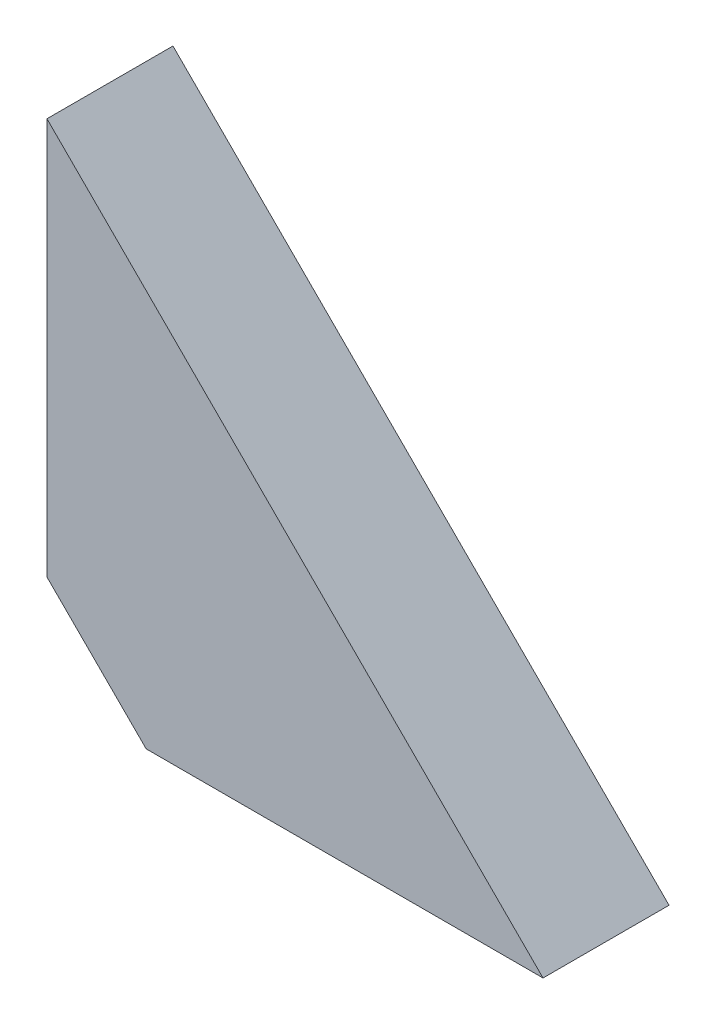
ISO-10303-21;
HEADER;
FILE_DESCRIPTION(('STEP AP214'),'2;1');
FILE_NAME('part.step','',(''),(''),'','','');
FILE_SCHEMA(('AUTOMOTIVE_DESIGN { 1 0 10303 214 1 1 1 1 }'));
ENDSEC;
DATA;
#1=APPLICATION_CONTEXT('core data for automotive mechanical design processes');
#2=APPLICATION_PROTOCOL_DEFINITION('international standard','automotive_design',2000,#1);
#3=PRODUCT_CONTEXT('',#1,'mechanical');
#4=PRODUCT('Part','Part','',(#3));
#5=PRODUCT_RELATED_PRODUCT_CATEGORY('part','',(#4));
#6=PRODUCT_DEFINITION_FORMATION('','',#4);
#7=PRODUCT_DEFINITION_CONTEXT('part definition',#1,'design');
#8=PRODUCT_DEFINITION('design','',#6,#7);
#9=PRODUCT_DEFINITION_SHAPE('','',#8);
#10=(LENGTH_UNIT() NAMED_UNIT(*) SI_UNIT(.MILLI.,.METRE.));
#11=(NAMED_UNIT(*) PLANE_ANGLE_UNIT() SI_UNIT($,.RADIAN.));
#12=(NAMED_UNIT(*) SI_UNIT($,.STERADIAN.) SOLID_ANGLE_UNIT());
#13=UNCERTAINTY_MEASURE_WITH_UNIT(LENGTH_MEASURE(1.E-05),#10,'distance_accuracy_value','');
#14=(GEOMETRIC_REPRESENTATION_CONTEXT(3) GLOBAL_UNCERTAINTY_ASSIGNED_CONTEXT((#13)) GLOBAL_UNIT_ASSIGNED_CONTEXT((#10,
#11,#12)) REPRESENTATION_CONTEXT('',''));
#15=CARTESIAN_POINT('',(0.,0.,0.));
#16=DIRECTION('',(0.,0.,1.));
#17=DIRECTION('',(1.,0.,0.));
#18=AXIS2_PLACEMENT_3D('',#15,#16,#17);
#19=CARTESIAN_POINT('',(0.,0.,-12.7));
#20=DIRECTION('',(-1.,0.,0.));
#21=DIRECTION('',(0.,0.,1.));
#22=AXIS2_PLACEMENT_3D('',#19,#20,#21);
#23=PLANE('',#22);
#24=DIRECTION('',(0.,-1.,0.));
#25=VECTOR('',#24,1.);
#26=CARTESIAN_POINT('',(0.,0.,-12.7));
#27=LINE('',#26,#25);
#28=CARTESIAN_POINT('',(0.,50.,-12.7));
#29=VERTEX_POINT('',#28);
#30=CARTESIAN_POINT('',(0.,10.,-12.7));
#31=VERTEX_POINT('',#30);
#32=EDGE_CURVE('E95',#29,#31,#27,.T.);
#33=ORIENTED_EDGE('',*,*,#32,.T.);
#34=DIRECTION('',(0.,0.,1.));
#35=VECTOR('',#34,1.);
#36=CARTESIAN_POINT('',(0.,10.,-12.7));
#37=LINE('',#36,#35);
#38=CARTESIAN_POINT('',(0.,10.,0.));
#39=VERTEX_POINT('',#38);
#40=EDGE_CURVE('E115',#31,#39,#37,.T.);
#41=ORIENTED_EDGE('',*,*,#40,.T.);
#42=DIRECTION('',(0.,-1.,0.));
#43=VECTOR('',#42,1.);
#44=CARTESIAN_POINT('',(0.,0.,0.));
#45=LINE('',#44,#43);
#46=CARTESIAN_POINT('',(0.,50.,0.));
#47=VERTEX_POINT('',#46);
#48=EDGE_CURVE('E110',#47,#39,#45,.T.);
#49=ORIENTED_EDGE('',*,*,#48,.F.);
#50=DIRECTION('',(0.,0.,1.));
#51=VECTOR('',#50,1.);
#52=CARTESIAN_POINT('',(0.,50.,-12.7));
#53=LINE('',#52,#51);
#54=EDGE_CURVE('E97',#29,#47,#53,.T.);
#55=ORIENTED_EDGE('',*,*,#54,.F.);
#56=EDGE_LOOP('',(#33,#41,#49,#55));
#57=FACE_BOUND('',#56,.T.);
#58=ADVANCED_FACE('F44',(#57),#23,.T.);
#59=CARTESIAN_POINT('',(0.,50.,-12.7));
#60=DIRECTION('',(0.707106781186548,0.707106781186548,0.));
#61=DIRECTION('',(-0.707106781186548,0.707106781186548,0.));
#62=AXIS2_PLACEMENT_3D('',#59,#60,#61);
#63=PLANE('',#62);
#64=DIRECTION('',(-0.707106781186547,0.707106781186547,0.));
#65=VECTOR('',#64,1.);
#66=CARTESIAN_POINT('',(0.,50.,0.));
#67=LINE('',#66,#65);
#68=CARTESIAN_POINT('',(50.,0.,0.));
#69=VERTEX_POINT('',#68);
#70=EDGE_CURVE('E98',#69,#47,#67,.T.);
#71=ORIENTED_EDGE('',*,*,#70,.F.);
#72=DIRECTION('',(0.,0.,1.));
#73=VECTOR('',#72,1.);
#74=CARTESIAN_POINT('',(50.,0.,-12.7));
#75=LINE('',#74,#73);
#76=CARTESIAN_POINT('',(50.,0.,-12.7));
#77=VERTEX_POINT('',#76);
#78=EDGE_CURVE('E88',#77,#69,#75,.T.);
#79=ORIENTED_EDGE('',*,*,#78,.F.);
#80=DIRECTION('',(-0.707106781186547,0.707106781186547,0.));
#81=VECTOR('',#80,1.);
#82=CARTESIAN_POINT('',(0.,50.,-12.7));
#83=LINE('',#82,#81);
#84=EDGE_CURVE('E93',#77,#29,#83,.T.);
#85=ORIENTED_EDGE('',*,*,#84,.T.);
#86=ORIENTED_EDGE('',*,*,#54,.T.);
#87=EDGE_LOOP('',(#71,#79,#85,#86));
#88=FACE_BOUND('',#87,.T.);
#89=ADVANCED_FACE('F96',(#88),#63,.T.);
#90=CARTESIAN_POINT('',(0.,0.,-12.7));
#91=DIRECTION('',(0.,-1.,0.));
#92=DIRECTION('',(0.,0.,-1.));
#93=AXIS2_PLACEMENT_3D('',#90,#91,#92);
#94=PLANE('',#93);
#95=DIRECTION('',(1.,0.,0.));
#96=VECTOR('',#95,1.);
#97=CARTESIAN_POINT('',(0.,0.,0.));
#98=LINE('',#97,#96);
#99=CARTESIAN_POINT('',(10.,0.,0.));
#100=VERTEX_POINT('',#99);
#101=EDGE_CURVE('E108',#100,#69,#98,.T.);
#102=ORIENTED_EDGE('',*,*,#101,.F.);
#103=DIRECTION('',(0.,0.,-1.));
#104=VECTOR('',#103,1.);
#105=CARTESIAN_POINT('',(10.,0.,-12.7));
#106=LINE('',#105,#104);
#107=CARTESIAN_POINT('',(10.,0.,-12.7));
#108=VERTEX_POINT('',#107);
#109=EDGE_CURVE('E53',#100,#108,#106,.T.);
#110=ORIENTED_EDGE('',*,*,#109,.T.);
#111=DIRECTION('',(1.,0.,0.));
#112=VECTOR('',#111,1.);
#113=CARTESIAN_POINT('',(0.,0.,-12.7));
#114=LINE('',#113,#112);
#115=EDGE_CURVE('E85',#108,#77,#114,.T.);
#116=ORIENTED_EDGE('',*,*,#115,.T.);
#117=ORIENTED_EDGE('',*,*,#78,.T.);
#118=EDGE_LOOP('',(#102,#110,#116,#117));
#119=FACE_BOUND('',#118,.T.);
#120=ADVANCED_FACE('F83',(#119),#94,.T.);
#121=CARTESIAN_POINT('',(0.,0.,-12.7));
#122=DIRECTION('',(0.,0.,-1.));
#123=DIRECTION('',(-1.,0.,0.));
#124=AXIS2_PLACEMENT_3D('',#121,#122,#123);
#125=PLANE('',#124);
#126=ORIENTED_EDGE('',*,*,#115,.F.);
#127=DIRECTION('',(0.707106781186549,-0.707106781186546,0.));
#128=VECTOR('',#127,1.);
#129=CARTESIAN_POINT('',(5.,5.00000000000002,-12.7));
#130=LINE('',#129,#128);
#131=EDGE_CURVE('E11',#108,#31,#130,.F.);
#132=ORIENTED_EDGE('',*,*,#131,.T.);
#133=ORIENTED_EDGE('',*,*,#32,.F.);
#134=ORIENTED_EDGE('',*,*,#84,.F.);
#135=EDGE_LOOP('',(#126,#132,#133,#134));
#136=FACE_BOUND('',#135,.T.);
#137=ADVANCED_FACE('F105',(#136),#125,.T.);
#138=CARTESIAN_POINT('',(0.,0.,0.));
#139=DIRECTION('',(0.,0.,-1.));
#140=DIRECTION('',(-1.,0.,0.));
#141=AXIS2_PLACEMENT_3D('',#138,#139,#140);
#142=PLANE('',#141);
#143=ORIENTED_EDGE('',*,*,#48,.T.);
#144=DIRECTION('',(-0.707106781186549,0.707106781186546,0.));
#145=VECTOR('',#144,1.);
#146=CARTESIAN_POINT('',(0.,10.,0.));
#147=LINE('',#146,#145);
#148=EDGE_CURVE('E68',#39,#100,#147,.F.);
#149=ORIENTED_EDGE('',*,*,#148,.T.);
#150=ORIENTED_EDGE('',*,*,#101,.T.);
#151=ORIENTED_EDGE('',*,*,#70,.T.);
#152=EDGE_LOOP('',(#143,#149,#150,#151));
#153=FACE_BOUND('',#152,.T.);
#154=ADVANCED_FACE('F116',(#153),#142,.F.);
#155=CARTESIAN_POINT('',(0.,10.,-12.7));
#156=DIRECTION('',(0.707106781186546,0.707106781186549,0.));
#157=DIRECTION('',(0.,0.,1.));
#158=AXIS2_PLACEMENT_3D('',#155,#156,#157);
#159=PLANE('',#158);
#160=ORIENTED_EDGE('',*,*,#131,.F.);
#161=ORIENTED_EDGE('',*,*,#109,.F.);
#162=ORIENTED_EDGE('',*,*,#148,.F.);
#163=ORIENTED_EDGE('',*,*,#40,.F.);
#164=EDGE_LOOP('',(#160,#161,#162,#163));
#165=FACE_BOUND('',#164,.T.);
#166=ADVANCED_FACE('F48',(#165),#159,.F.);
#167=CLOSED_SHELL('',(#58,#89,#120,#137,#154,#166));
#168=MANIFOLD_SOLID_BREP('B2',#167);
#169=ADVANCED_BREP_SHAPE_REPRESENTATION('',(#18,#168),#14);
#170=SHAPE_DEFINITION_REPRESENTATION(#9,#169);
ENDSEC;
END-ISO-10303-21;
